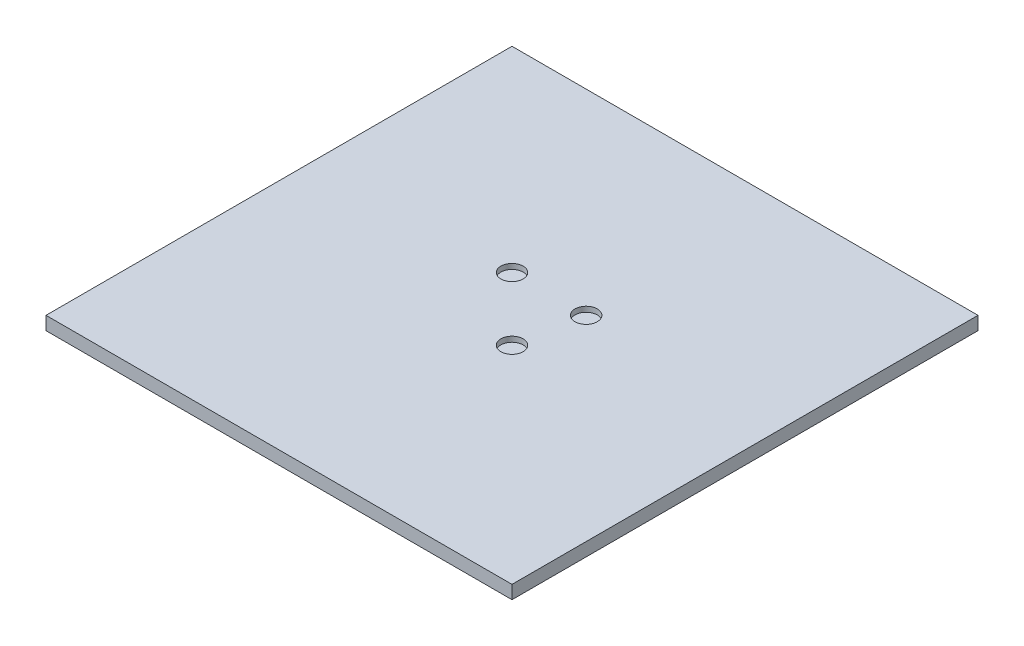
ISO-10303-21;
HEADER;
FILE_DESCRIPTION(('STEP AP214'),'2;1');
FILE_NAME('part.step','',(''),(''),'','','');
FILE_SCHEMA(('AUTOMOTIVE_DESIGN { 1 0 10303 214 1 1 1 1 }'));
ENDSEC;
DATA;
#1=APPLICATION_CONTEXT('core data for automotive mechanical design processes');
#2=APPLICATION_PROTOCOL_DEFINITION('international standard','automotive_design',2000,#1);
#3=PRODUCT_CONTEXT('',#1,'mechanical');
#4=PRODUCT('Part','Part','',(#3));
#5=PRODUCT_RELATED_PRODUCT_CATEGORY('part','',(#4));
#6=PRODUCT_DEFINITION_FORMATION('','',#4);
#7=PRODUCT_DEFINITION_CONTEXT('part definition',#1,'design');
#8=PRODUCT_DEFINITION('design','',#6,#7);
#9=PRODUCT_DEFINITION_SHAPE('','',#8);
#10=(LENGTH_UNIT() NAMED_UNIT(*) SI_UNIT(.MILLI.,.METRE.));
#11=(NAMED_UNIT(*) PLANE_ANGLE_UNIT() SI_UNIT($,.RADIAN.));
#12=(NAMED_UNIT(*) SI_UNIT($,.STERADIAN.) SOLID_ANGLE_UNIT());
#13=UNCERTAINTY_MEASURE_WITH_UNIT(LENGTH_MEASURE(1.E-05),#10,'distance_accuracy_value','');
#14=(GEOMETRIC_REPRESENTATION_CONTEXT(3) GLOBAL_UNCERTAINTY_ASSIGNED_CONTEXT((#13)) GLOBAL_UNIT_ASSIGNED_CONTEXT((#10,
#11,#12)) REPRESENTATION_CONTEXT('',''));
#15=CARTESIAN_POINT('',(0.,0.,0.));
#16=DIRECTION('',(0.,0.,1.));
#17=DIRECTION('',(1.,0.,0.));
#18=AXIS2_PLACEMENT_3D('',#15,#16,#17);
#19=CARTESIAN_POINT('',(44.45,2.54,44.45));
#20=DIRECTION('',(-1.,0.,0.));
#21=DIRECTION('',(0.,0.,1.));
#22=AXIS2_PLACEMENT_3D('',#19,#20,#21);
#23=PLANE('',#22);
#24=DIRECTION('',(0.,0.,-1.));
#25=VECTOR('',#24,1.);
#26=CARTESIAN_POINT('',(44.45,0.,44.45));
#27=LINE('',#26,#25);
#28=CARTESIAN_POINT('',(44.45,0.,44.45));
#29=VERTEX_POINT('',#28);
#30=CARTESIAN_POINT('',(44.45,0.,-44.45));
#31=VERTEX_POINT('',#30);
#32=EDGE_CURVE('E100',#29,#31,#27,.T.);
#33=ORIENTED_EDGE('',*,*,#32,.T.);
#34=DIRECTION('',(0.,-1.,0.));
#35=VECTOR('',#34,1.);
#36=CARTESIAN_POINT('',(44.45,2.54,-44.45));
#37=LINE('',#36,#35);
#38=CARTESIAN_POINT('',(44.45,2.54,-44.45));
#39=VERTEX_POINT('',#38);
#40=EDGE_CURVE('E11',#39,#31,#37,.T.);
#41=ORIENTED_EDGE('',*,*,#40,.F.);
#42=DIRECTION('',(0.,0.,-1.));
#43=VECTOR('',#42,1.);
#44=CARTESIAN_POINT('',(44.45,2.54,44.45));
#45=LINE('',#44,#43);
#46=CARTESIAN_POINT('',(44.45,2.54,44.45));
#47=VERTEX_POINT('',#46);
#48=EDGE_CURVE('E88',#47,#39,#45,.T.);
#49=ORIENTED_EDGE('',*,*,#48,.F.);
#50=DIRECTION('',(0.,-1.,0.));
#51=VECTOR('',#50,1.);
#52=CARTESIAN_POINT('',(44.45,2.54,44.45));
#53=LINE('',#52,#51);
#54=EDGE_CURVE('E96',#47,#29,#53,.T.);
#55=ORIENTED_EDGE('',*,*,#54,.T.);
#56=EDGE_LOOP('',(#33,#41,#49,#55));
#57=FACE_BOUND('',#56,.T.);
#58=ADVANCED_FACE('F37',(#57),#23,.F.);
#59=CARTESIAN_POINT('',(-44.45,2.54,-44.45));
#60=DIRECTION('',(0.,0.,1.));
#61=DIRECTION('',(1.,0.,0.));
#62=AXIS2_PLACEMENT_3D('',#59,#60,#61);
#63=PLANE('',#62);
#64=DIRECTION('',(-1.,0.,0.));
#65=VECTOR('',#64,1.);
#66=CARTESIAN_POINT('',(-44.45,0.,-44.45));
#67=LINE('',#66,#65);
#68=CARTESIAN_POINT('',(-44.45,0.,-44.45));
#69=VERTEX_POINT('',#68);
#70=EDGE_CURVE('E92',#31,#69,#67,.T.);
#71=ORIENTED_EDGE('',*,*,#70,.T.);
#72=DIRECTION('',(0.,-1.,0.));
#73=VECTOR('',#72,1.);
#74=CARTESIAN_POINT('',(-44.45,2.54,-44.45));
#75=LINE('',#74,#73);
#76=CARTESIAN_POINT('',(-44.45,2.54,-44.45));
#77=VERTEX_POINT('',#76);
#78=EDGE_CURVE('E45',#77,#69,#75,.T.);
#79=ORIENTED_EDGE('',*,*,#78,.F.);
#80=DIRECTION('',(-1.,0.,0.));
#81=VECTOR('',#80,1.);
#82=CARTESIAN_POINT('',(-44.45,2.54,-44.45));
#83=LINE('',#82,#81);
#84=EDGE_CURVE('E83',#39,#77,#83,.T.);
#85=ORIENTED_EDGE('',*,*,#84,.F.);
#86=ORIENTED_EDGE('',*,*,#40,.T.);
#87=EDGE_LOOP('',(#71,#79,#85,#86));
#88=FACE_BOUND('',#87,.T.);
#89=ADVANCED_FACE('F91',(#88),#63,.F.);
#90=CARTESIAN_POINT('',(-44.45,2.54,44.45));
#91=DIRECTION('',(1.,0.,0.));
#92=DIRECTION('',(0.,0.,-1.));
#93=AXIS2_PLACEMENT_3D('',#90,#91,#92);
#94=PLANE('',#93);
#95=DIRECTION('',(0.,0.,1.));
#96=VECTOR('',#95,1.);
#97=CARTESIAN_POINT('',(-44.45,0.,44.45));
#98=LINE('',#97,#96);
#99=CARTESIAN_POINT('',(-44.45,0.,44.45));
#100=VERTEX_POINT('',#99);
#101=EDGE_CURVE('E70',#69,#100,#98,.T.);
#102=ORIENTED_EDGE('',*,*,#101,.T.);
#103=DIRECTION('',(0.,-1.,0.));
#104=VECTOR('',#103,1.);
#105=CARTESIAN_POINT('',(-44.45,2.54,44.45));
#106=LINE('',#105,#104);
#107=CARTESIAN_POINT('',(-44.45,2.54,44.45));
#108=VERTEX_POINT('',#107);
#109=EDGE_CURVE('E93',#108,#100,#106,.T.);
#110=ORIENTED_EDGE('',*,*,#109,.F.);
#111=DIRECTION('',(0.,0.,1.));
#112=VECTOR('',#111,1.);
#113=CARTESIAN_POINT('',(-44.45,2.54,44.45));
#114=LINE('',#113,#112);
#115=EDGE_CURVE('E86',#77,#108,#114,.T.);
#116=ORIENTED_EDGE('',*,*,#115,.F.);
#117=ORIENTED_EDGE('',*,*,#78,.T.);
#118=EDGE_LOOP('',(#102,#110,#116,#117));
#119=FACE_BOUND('',#118,.T.);
#120=ADVANCED_FACE('F94',(#119),#94,.F.);
#121=CARTESIAN_POINT('',(-44.45,2.54,44.45));
#122=DIRECTION('',(0.,0.,-1.));
#123=DIRECTION('',(-1.,0.,0.));
#124=AXIS2_PLACEMENT_3D('',#121,#122,#123);
#125=PLANE('',#124);
#126=DIRECTION('',(1.,0.,0.));
#127=VECTOR('',#126,1.);
#128=CARTESIAN_POINT('',(-44.45,0.,44.45));
#129=LINE('',#128,#127);
#130=EDGE_CURVE('E76',#100,#29,#129,.T.);
#131=ORIENTED_EDGE('',*,*,#130,.T.);
#132=ORIENTED_EDGE('',*,*,#54,.F.);
#133=DIRECTION('',(1.,0.,0.));
#134=VECTOR('',#133,1.);
#135=CARTESIAN_POINT('',(-44.45,2.54,44.45));
#136=LINE('',#135,#134);
#137=EDGE_CURVE('E53',#108,#47,#136,.T.);
#138=ORIENTED_EDGE('',*,*,#137,.F.);
#139=ORIENTED_EDGE('',*,*,#109,.T.);
#140=EDGE_LOOP('',(#131,#132,#138,#139));
#141=FACE_BOUND('',#140,.T.);
#142=ADVANCED_FACE('F108',(#141),#125,.F.);
#143=CARTESIAN_POINT('',(0.,2.54,0.));
#144=DIRECTION('',(0.,-1.,0.));
#145=DIRECTION('',(0.,0.,-1.));
#146=AXIS2_PLACEMENT_3D('',#143,#144,#145);
#147=PLANE('',#146);
#148=CARTESIAN_POINT('',(-7.07106781186547,2.54,-7.07106781186548));
#149=DIRECTION('',(0.,1.,0.));
#150=DIRECTION('',(0.,0.,1.));
#151=AXIS2_PLACEMENT_3D('',#148,#149,#150);
#152=CIRCLE('',#151,2.125);
#153=CARTESIAN_POINT('',(-7.07106781186547,2.54,-4.94606781186548));
#154=VERTEX_POINT('',#153);
#155=EDGE_CURVE('E126',#154,#154,#152,.T.);
#156=ORIENTED_EDGE('',*,*,#155,.F.);
#157=EDGE_LOOP('',(#156));
#158=FACE_BOUND('',#157,.T.);
#159=CARTESIAN_POINT('',(7.07106781186548,2.54,-7.07106781186548));
#160=DIRECTION('',(0.,1.,0.));
#161=DIRECTION('',(0.,0.,1.));
#162=AXIS2_PLACEMENT_3D('',#159,#160,#161);
#163=CIRCLE('',#162,2.125);
#164=CARTESIAN_POINT('',(7.07106781186548,2.54,-4.94606781186548));
#165=VERTEX_POINT('',#164);
#166=EDGE_CURVE('E120',#165,#165,#163,.T.);
#167=ORIENTED_EDGE('',*,*,#166,.F.);
#168=EDGE_LOOP('',(#167));
#169=FACE_BOUND('',#168,.T.);
#170=CARTESIAN_POINT('',(4.94974746830584,2.54,4.94974746830583));
#171=DIRECTION('',(0.,1.,0.));
#172=DIRECTION('',(0.,0.,1.));
#173=AXIS2_PLACEMENT_3D('',#170,#171,#172);
#174=CIRCLE('',#173,2.125);
#175=CARTESIAN_POINT('',(4.94974746830584,2.54,7.07474746830583));
#176=VERTEX_POINT('',#175);
#177=EDGE_CURVE('E114',#176,#176,#174,.T.);
#178=ORIENTED_EDGE('',*,*,#177,.F.);
#179=EDGE_LOOP('',(#178));
#180=FACE_BOUND('',#179,.T.);
#181=ORIENTED_EDGE('',*,*,#48,.T.);
#182=ORIENTED_EDGE('',*,*,#84,.T.);
#183=ORIENTED_EDGE('',*,*,#115,.T.);
#184=ORIENTED_EDGE('',*,*,#137,.T.);
#185=EDGE_LOOP('',(#181,#182,#183,#184));
#186=FACE_BOUND('',#185,.T.);
#187=ADVANCED_FACE('F84',(#158,#169,#180,#186),#147,.F.);
#188=CARTESIAN_POINT('',(0.,0.,0.));
#189=DIRECTION('',(0.,-1.,0.));
#190=DIRECTION('',(0.,0.,-1.));
#191=AXIS2_PLACEMENT_3D('',#188,#189,#190);
#192=PLANE('',#191);
#193=ORIENTED_EDGE('',*,*,#32,.F.);
#194=ORIENTED_EDGE('',*,*,#130,.F.);
#195=ORIENTED_EDGE('',*,*,#101,.F.);
#196=ORIENTED_EDGE('',*,*,#70,.F.);
#197=EDGE_LOOP('',(#193,#194,#195,#196));
#198=FACE_BOUND('',#197,.T.);
#199=ADVANCED_FACE('F111',(#198),#192,.T.);
#200=CARTESIAN_POINT('',(4.94974746830584,1.54,4.94974746830583));
#201=DIRECTION('',(0.,1.,0.));
#202=DIRECTION('',(0.,0.,1.));
#203=AXIS2_PLACEMENT_3D('',#200,#201,#202);
#204=CYLINDRICAL_SURFACE('',#203,2.125);
#205=CARTESIAN_POINT('',(4.94974746830584,1.54,4.94974746830583));
#206=DIRECTION('',(0.,1.,0.));
#207=DIRECTION('',(0.,0.,1.));
#208=AXIS2_PLACEMENT_3D('',#205,#206,#207);
#209=CIRCLE('',#208,2.125);
#210=CARTESIAN_POINT('',(4.94974746830584,1.54,7.07474746830583));
#211=VERTEX_POINT('',#210);
#212=EDGE_CURVE('E117',#211,#211,#209,.T.);
#213=ORIENTED_EDGE('',*,*,#212,.F.);
#214=EDGE_LOOP('',(#213));
#215=FACE_BOUND('',#214,.T.);
#216=ORIENTED_EDGE('',*,*,#177,.T.);
#217=EDGE_LOOP('',(#216));
#218=FACE_BOUND('',#217,.T.);
#219=ADVANCED_FACE('F148',(#215,#218),#204,.F.);
#220=CARTESIAN_POINT('',(0.,1.54,0.));
#221=DIRECTION('',(0.,1.,0.));
#222=DIRECTION('',(0.,0.,1.));
#223=AXIS2_PLACEMENT_3D('',#220,#221,#222);
#224=PLANE('',#223);
#225=ORIENTED_EDGE('',*,*,#212,.T.);
#226=EDGE_LOOP('',(#225));
#227=FACE_BOUND('',#226,.T.);
#228=ADVANCED_FACE('F150',(#227),#224,.T.);
#229=CARTESIAN_POINT('',(7.07106781186548,1.54,-7.07106781186548));
#230=DIRECTION('',(0.,1.,0.));
#231=DIRECTION('',(0.,0.,1.));
#232=AXIS2_PLACEMENT_3D('',#229,#230,#231);
#233=CYLINDRICAL_SURFACE('',#232,2.125);
#234=CARTESIAN_POINT('',(7.07106781186548,1.54,-7.07106781186548));
#235=DIRECTION('',(0.,1.,0.));
#236=DIRECTION('',(0.,0.,1.));
#237=AXIS2_PLACEMENT_3D('',#234,#235,#236);
#238=CIRCLE('',#237,2.125);
#239=CARTESIAN_POINT('',(7.07106781186548,1.54,-4.94606781186548));
#240=VERTEX_POINT('',#239);
#241=EDGE_CURVE('E123',#240,#240,#238,.T.);
#242=ORIENTED_EDGE('',*,*,#241,.F.);
#243=EDGE_LOOP('',(#242));
#244=FACE_BOUND('',#243,.T.);
#245=ORIENTED_EDGE('',*,*,#166,.T.);
#246=EDGE_LOOP('',(#245));
#247=FACE_BOUND('',#246,.T.);
#248=ADVANCED_FACE('F157',(#244,#247),#233,.F.);
#249=CARTESIAN_POINT('',(0.,1.54,0.));
#250=DIRECTION('',(0.,1.,0.));
#251=DIRECTION('',(0.,0.,1.));
#252=AXIS2_PLACEMENT_3D('',#249,#250,#251);
#253=PLANE('',#252);
#254=ORIENTED_EDGE('',*,*,#241,.T.);
#255=EDGE_LOOP('',(#254));
#256=FACE_BOUND('',#255,.T.);
#257=ADVANCED_FACE('F137',(#256),#253,.T.);
#258=CARTESIAN_POINT('',(-7.07106781186547,1.54,-7.07106781186548));
#259=DIRECTION('',(0.,1.,0.));
#260=DIRECTION('',(0.,0.,1.));
#261=AXIS2_PLACEMENT_3D('',#258,#259,#260);
#262=CYLINDRICAL_SURFACE('',#261,2.125);
#263=CARTESIAN_POINT('',(-7.07106781186547,1.54,-7.07106781186548));
#264=DIRECTION('',(0.,1.,0.));
#265=DIRECTION('',(0.,0.,1.));
#266=AXIS2_PLACEMENT_3D('',#263,#264,#265);
#267=CIRCLE('',#266,2.125);
#268=CARTESIAN_POINT('',(-7.07106781186547,1.54,-4.94606781186548));
#269=VERTEX_POINT('',#268);
#270=EDGE_CURVE('E103',#269,#269,#267,.T.);
#271=ORIENTED_EDGE('',*,*,#270,.F.);
#272=EDGE_LOOP('',(#271));
#273=FACE_BOUND('',#272,.T.);
#274=ORIENTED_EDGE('',*,*,#155,.T.);
#275=EDGE_LOOP('',(#274));
#276=FACE_BOUND('',#275,.T.);
#277=ADVANCED_FACE('F134',(#273,#276),#262,.F.);
#278=CARTESIAN_POINT('',(0.,1.54,0.));
#279=DIRECTION('',(0.,1.,0.));
#280=DIRECTION('',(0.,0.,1.));
#281=AXIS2_PLACEMENT_3D('',#278,#279,#280);
#282=PLANE('',#281);
#283=ORIENTED_EDGE('',*,*,#270,.T.);
#284=EDGE_LOOP('',(#283));
#285=FACE_BOUND('',#284,.T.);
#286=ADVANCED_FACE('F132',(#285),#282,.T.);
#287=CLOSED_SHELL('',(#58,#89,#120,#142,#187,#199,#219,#228,#248,#257,#277,#286));
#288=MANIFOLD_SOLID_BREP('B2',#287);
#289=ADVANCED_BREP_SHAPE_REPRESENTATION('',(#18,#288),#14);
#290=SHAPE_DEFINITION_REPRESENTATION(#9,#289);
ENDSEC;
END-ISO-10303-21;
